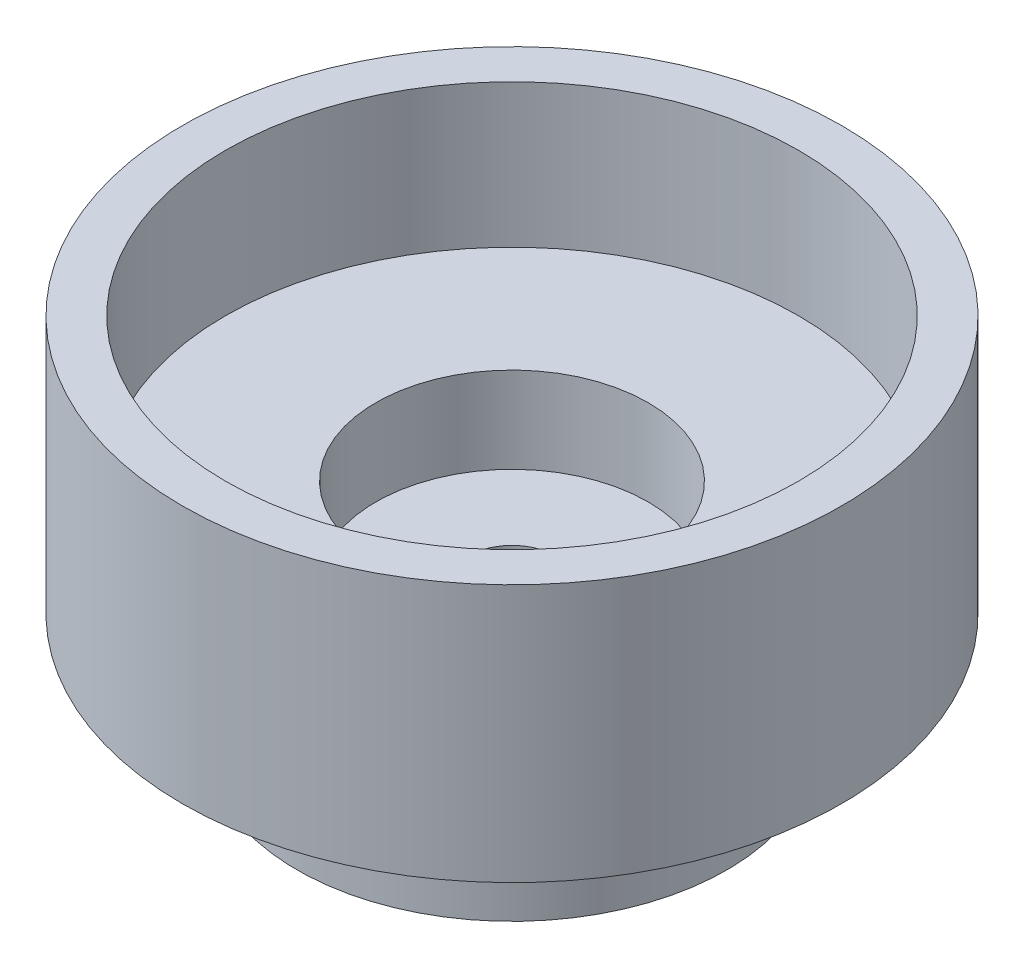
ISO-10303-21;
HEADER;
FILE_DESCRIPTION(('STEP AP214'),'2;1');
FILE_NAME('part.step','',(''),(''),'','','');
FILE_SCHEMA(('AUTOMOTIVE_DESIGN { 1 0 10303 214 1 1 1 1 }'));
ENDSEC;
DATA;
#1=APPLICATION_CONTEXT('core data for automotive mechanical design processes');
#2=APPLICATION_PROTOCOL_DEFINITION('international standard','automotive_design',2000,#1);
#3=PRODUCT_CONTEXT('',#1,'mechanical');
#4=PRODUCT('Part','Part','',(#3));
#5=PRODUCT_RELATED_PRODUCT_CATEGORY('part','',(#4));
#6=PRODUCT_DEFINITION_FORMATION('','',#4);
#7=PRODUCT_DEFINITION_CONTEXT('part definition',#1,'design');
#8=PRODUCT_DEFINITION('design','',#6,#7);
#9=PRODUCT_DEFINITION_SHAPE('','',#8);
#10=(LENGTH_UNIT() NAMED_UNIT(*) SI_UNIT(.MILLI.,.METRE.));
#11=(NAMED_UNIT(*) PLANE_ANGLE_UNIT() SI_UNIT($,.RADIAN.));
#12=(NAMED_UNIT(*) SI_UNIT($,.STERADIAN.) SOLID_ANGLE_UNIT());
#13=UNCERTAINTY_MEASURE_WITH_UNIT(LENGTH_MEASURE(1.E-05),#10,'distance_accuracy_value','');
#14=(GEOMETRIC_REPRESENTATION_CONTEXT(3) GLOBAL_UNCERTAINTY_ASSIGNED_CONTEXT((#13)) GLOBAL_UNIT_ASSIGNED_CONTEXT((#10,
#11,#12)) REPRESENTATION_CONTEXT('',''));
#15=CARTESIAN_POINT('',(0.,0.,0.));
#16=DIRECTION('',(0.,0.,1.));
#17=DIRECTION('',(1.,0.,0.));
#18=AXIS2_PLACEMENT_3D('',#15,#16,#17);
#19=CARTESIAN_POINT('',(0.,1.5,0.));
#20=DIRECTION('',(0.,1.,0.));
#21=DIRECTION('',(0.,0.,1.));
#22=AXIS2_PLACEMENT_3D('',#19,#20,#21);
#23=CYLINDRICAL_SURFACE('',#22,3.);
#24=CARTESIAN_POINT('',(0.,6.,0.));
#25=DIRECTION('',(0.,-1.,0.));
#26=DIRECTION('',(0.,0.,-1.));
#27=AXIS2_PLACEMENT_3D('',#24,#25,#26);
#28=CIRCLE('',#27,3.);
#29=CARTESIAN_POINT('',(0.,6.,-3.));
#30=VERTEX_POINT('',#29);
#31=EDGE_CURVE('E47',#30,#30,#28,.T.);
#32=ORIENTED_EDGE('',*,*,#31,.T.);
#33=EDGE_LOOP('',(#32));
#34=FACE_BOUND('',#33,.T.);
#35=CARTESIAN_POINT('',(0.,10.,0.));
#36=DIRECTION('',(0.,1.,0.));
#37=DIRECTION('',(0.,0.,1.));
#38=AXIS2_PLACEMENT_3D('',#35,#36,#37);
#39=CIRCLE('',#38,3.);
#40=CARTESIAN_POINT('',(0.,10.,3.));
#41=VERTEX_POINT('',#40);
#42=EDGE_CURVE('E35',#41,#41,#39,.F.);
#43=ORIENTED_EDGE('',*,*,#42,.F.);
#44=EDGE_LOOP('',(#43));
#45=FACE_BOUND('',#44,.T.);
#46=ADVANCED_FACE('F31',(#34,#45),#23,.F.);
#47=CARTESIAN_POINT('',(0.,26.,0.));
#48=DIRECTION('',(0.,-1.,0.));
#49=DIRECTION('',(0.,0.,-1.));
#50=AXIS2_PLACEMENT_3D('',#47,#48,#49);
#51=CYLINDRICAL_SURFACE('',#50,23.);
#52=CARTESIAN_POINT('',(0.,26.,0.));
#53=DIRECTION('',(0.,1.,0.));
#54=DIRECTION('',(0.,0.,1.));
#55=AXIS2_PLACEMENT_3D('',#52,#53,#54);
#56=CIRCLE('',#55,23.);
#57=CARTESIAN_POINT('',(0.,26.,-23.));
#58=VERTEX_POINT('',#57);
#59=EDGE_CURVE('E10',#58,#58,#56,.T.);
#60=CARTESIAN_POINT('',(0.,8.,0.));
#61=DIRECTION('',(0.,-1.,0.));
#62=DIRECTION('',(0.,0.,-1.));
#63=AXIS2_PLACEMENT_3D('',#60,#61,#62);
#64=CIRCLE('',#63,23.);
#65=CARTESIAN_POINT('',(0.,8.,-23.));
#66=VERTEX_POINT('',#65);
#67=EDGE_CURVE('E39',#66,#66,#64,.T.);
#68=CARTESIAN_POINT('',(0.,26.,-23.));
#69=CARTESIAN_POINT('',(0.,25.8125,-23.));
#70=CARTESIAN_POINT('',(0.,25.625,-23.));
#71=CARTESIAN_POINT('',(0.,25.25,-23.));
#72=CARTESIAN_POINT('',(0.,25.0625,-23.));
#73=CARTESIAN_POINT('',(0.,24.6875,-23.));
#74=CARTESIAN_POINT('',(0.,24.5,-23.));
#75=CARTESIAN_POINT('',(0.,24.125,-23.));
#76=CARTESIAN_POINT('',(0.,23.9375,-23.));
#77=CARTESIAN_POINT('',(0.,23.5625,-23.));
#78=CARTESIAN_POINT('',(0.,23.375,-23.));
#79=CARTESIAN_POINT('',(0.,23.,-23.));
#80=CARTESIAN_POINT('',(0.,22.8125,-23.));
#81=CARTESIAN_POINT('',(0.,22.4375,-23.));
#82=CARTESIAN_POINT('',(0.,22.25,-23.));
#83=CARTESIAN_POINT('',(0.,21.875,-23.));
#84=CARTESIAN_POINT('',(0.,21.6875,-23.));
#85=CARTESIAN_POINT('',(0.,21.3125,-23.));
#86=CARTESIAN_POINT('',(0.,21.125,-23.));
#87=CARTESIAN_POINT('',(0.,20.75,-23.));
#88=CARTESIAN_POINT('',(0.,20.5625,-23.));
#89=CARTESIAN_POINT('',(0.,20.1875,-23.));
#90=CARTESIAN_POINT('',(0.,20.,-23.));
#91=CARTESIAN_POINT('',(0.,19.625,-23.));
#92=CARTESIAN_POINT('',(0.,19.4375,-23.));
#93=CARTESIAN_POINT('',(0.,19.0625,-23.));
#94=CARTESIAN_POINT('',(0.,18.875,-23.));
#95=CARTESIAN_POINT('',(0.,18.5,-23.));
#96=CARTESIAN_POINT('',(0.,18.3125,-23.));
#97=CARTESIAN_POINT('',(0.,17.9375,-23.));
#98=CARTESIAN_POINT('',(0.,17.75,-23.));
#99=CARTESIAN_POINT('',(0.,17.375,-23.));
#100=CARTESIAN_POINT('',(0.,17.1875,-23.));
#101=CARTESIAN_POINT('',(0.,16.8125,-23.));
#102=CARTESIAN_POINT('',(0.,16.625,-23.));
#103=CARTESIAN_POINT('',(0.,16.25,-23.));
#104=CARTESIAN_POINT('',(0.,16.0625,-23.));
#105=CARTESIAN_POINT('',(0.,15.6875,-23.));
#106=CARTESIAN_POINT('',(0.,15.5,-23.));
#107=CARTESIAN_POINT('',(0.,15.125,-23.));
#108=CARTESIAN_POINT('',(0.,14.9375,-23.));
#109=CARTESIAN_POINT('',(0.,14.5625,-23.));
#110=CARTESIAN_POINT('',(0.,14.375,-23.));
#111=CARTESIAN_POINT('',(0.,14.,-23.));
#112=CARTESIAN_POINT('',(0.,13.8125,-23.));
#113=CARTESIAN_POINT('',(0.,13.4375,-23.));
#114=CARTESIAN_POINT('',(0.,13.25,-23.));
#115=CARTESIAN_POINT('',(0.,12.875,-23.));
#116=CARTESIAN_POINT('',(0.,12.6875,-23.));
#117=CARTESIAN_POINT('',(0.,12.3125,-23.));
#118=CARTESIAN_POINT('',(0.,12.125,-23.));
#119=CARTESIAN_POINT('',(0.,11.75,-23.));
#120=CARTESIAN_POINT('',(0.,11.5625,-23.));
#121=CARTESIAN_POINT('',(0.,11.1875,-23.));
#122=CARTESIAN_POINT('',(0.,11.,-23.));
#123=CARTESIAN_POINT('',(0.,10.625,-23.));
#124=CARTESIAN_POINT('',(0.,10.4375,-23.));
#125=CARTESIAN_POINT('',(0.,10.0625,-23.));
#126=CARTESIAN_POINT('',(0.,9.875,-23.));
#127=CARTESIAN_POINT('',(0.,9.5,-23.));
#128=CARTESIAN_POINT('',(0.,9.3125,-23.));
#129=CARTESIAN_POINT('',(0.,8.9375,-23.));
#130=CARTESIAN_POINT('',(0.,8.75,-23.));
#131=CARTESIAN_POINT('',(0.,8.375,-23.));
#132=CARTESIAN_POINT('',(0.,8.1875,-23.));
#133=CARTESIAN_POINT('',(0.,8.,-23.));
#134=B_SPLINE_CURVE_WITH_KNOTS('',3,(#68,#69,#70,#71,#72,#73,#74,#75,#76,#77,#78,#79,#80,#81,
#82,#83,#84,#85,#86,#87,#88,#89,#90,#91,#92,#93,#94,#95,#96,#97,#98,#99,#100,#101,#102,#103,
#104,#105,#106,#107,#108,#109,#110,#111,#112,#113,#114,#115,#116,#117,#118,#119,#120,#121,#122,
#123,#124,#125,#126,#127,#128,#129,#130,#131,#132,#133),.UNSPECIFIED.,.F.,.F.,(4,2,2,2,2,2,2,2,
2,2,2,2,2,2,2,2,2,2,2,2,2,2,2,2,2,2,2,2,2,2,2,2,4),(0.,0.5625,1.125,1.6875,2.25,2.8125,3.375,
3.9375,4.5,5.0625,5.625,6.1875,6.75,7.3125,7.875,8.4375,9.,9.5625,10.125,10.6875,11.25,11.8125,
12.375,12.9375,13.5,14.0625,14.625,15.1875,15.75,16.3125,16.875,17.4375,18.),.UNSPECIFIED.);
#135=EDGE_CURVE('BSEAM33',#58,#66,#134,.T.);
#136=ORIENTED_EDGE('',*,*,#59,.F.);
#137=ORIENTED_EDGE('',*,*,#67,.F.);
#138=ORIENTED_EDGE('',*,*,#135,.T.);
#139=ORIENTED_EDGE('',*,*,#135,.F.);
#140=EDGE_LOOP('',(#136,#138,#137,#139));
#141=FACE_BOUND('',#140,.T.);
#142=ADVANCED_FACE('F33',(#141),#51,.T.);
#143=CARTESIAN_POINT('',(0.,26.,0.));
#144=DIRECTION('',(0.,1.,0.));
#145=DIRECTION('',(0.,0.,1.));
#146=AXIS2_PLACEMENT_3D('',#143,#144,#145);
#147=PLANE('',#146);
#148=CARTESIAN_POINT('',(0.,26.,0.));
#149=DIRECTION('',(0.,1.,0.));
#150=DIRECTION('',(0.,0.,1.));
#151=AXIS2_PLACEMENT_3D('',#148,#149,#150);
#152=CIRCLE('',#151,20.);
#153=CARTESIAN_POINT('',(0.,26.,20.));
#154=VERTEX_POINT('',#153);
#155=EDGE_CURVE('E57',#154,#154,#152,.T.);
#156=ORIENTED_EDGE('',*,*,#155,.F.);
#157=EDGE_LOOP('',(#156));
#158=FACE_BOUND('',#157,.T.);
#159=ORIENTED_EDGE('',*,*,#59,.T.);
#160=EDGE_LOOP('',(#159));
#161=FACE_BOUND('',#160,.T.);
#162=ADVANCED_FACE('F87',(#158,#161),#147,.T.);
#163=CARTESIAN_POINT('',(0.,8.,0.));
#164=DIRECTION('',(0.,-1.,0.));
#165=DIRECTION('',(0.,0.,-1.));
#166=AXIS2_PLACEMENT_3D('',#163,#164,#165);
#167=PLANE('',#166);
#168=CARTESIAN_POINT('',(0.,8.,0.));
#169=DIRECTION('',(0.,-1.,0.));
#170=DIRECTION('',(0.,0.,-1.));
#171=AXIS2_PLACEMENT_3D('',#168,#169,#170);
#172=CIRCLE('',#171,15.);
#173=CARTESIAN_POINT('',(0.,8.,-15.));
#174=VERTEX_POINT('',#173);
#175=EDGE_CURVE('E44',#174,#174,#172,.T.);
#176=ORIENTED_EDGE('',*,*,#175,.F.);
#177=EDGE_LOOP('',(#176));
#178=FACE_BOUND('',#177,.T.);
#179=ORIENTED_EDGE('',*,*,#67,.T.);
#180=EDGE_LOOP('',(#179));
#181=FACE_BOUND('',#180,.T.);
#182=ADVANCED_FACE('F78',(#178,#181),#167,.T.);
#183=CARTESIAN_POINT('',(0.,8.,0.));
#184=DIRECTION('',(0.,-1.,0.));
#185=DIRECTION('',(0.,0.,-1.));
#186=AXIS2_PLACEMENT_3D('',#183,#184,#185);
#187=CYLINDRICAL_SURFACE('',#186,15.);
#188=ORIENTED_EDGE('',*,*,#175,.T.);
#189=EDGE_LOOP('',(#188));
#190=FACE_BOUND('',#189,.T.);
#191=CARTESIAN_POINT('',(0.,0.,0.));
#192=DIRECTION('',(0.,-1.,0.));
#193=DIRECTION('',(0.,0.,-1.));
#194=AXIS2_PLACEMENT_3D('',#191,#192,#193);
#195=CIRCLE('',#194,15.);
#196=CARTESIAN_POINT('',(0.,0.,-15.));
#197=VERTEX_POINT('',#196);
#198=EDGE_CURVE('E68',#197,#197,#195,.T.);
#199=ORIENTED_EDGE('',*,*,#198,.F.);
#200=EDGE_LOOP('',(#199));
#201=FACE_BOUND('',#200,.T.);
#202=ADVANCED_FACE('F76',(#190,#201),#187,.T.);
#203=CARTESIAN_POINT('',(0.,0.,0.));
#204=DIRECTION('',(0.,1.,0.));
#205=DIRECTION('',(0.,0.,1.));
#206=AXIS2_PLACEMENT_3D('',#203,#204,#205);
#207=PLANE('',#206);
#208=CARTESIAN_POINT('',(0.,0.,0.));
#209=DIRECTION('',(0.,-1.,0.));
#210=DIRECTION('',(0.,0.,-1.));
#211=AXIS2_PLACEMENT_3D('',#208,#209,#210);
#212=CIRCLE('',#211,9.5);
#213=CARTESIAN_POINT('',(0.,0.,-9.5));
#214=VERTEX_POINT('',#213);
#215=EDGE_CURVE('E49',#214,#214,#212,.T.);
#216=ORIENTED_EDGE('',*,*,#215,.F.);
#217=EDGE_LOOP('',(#216));
#218=FACE_BOUND('',#217,.T.);
#219=ORIENTED_EDGE('',*,*,#198,.T.);
#220=EDGE_LOOP('',(#219));
#221=FACE_BOUND('',#220,.T.);
#222=ADVANCED_FACE('F74',(#218,#221),#207,.F.);
#223=CARTESIAN_POINT('',(0.,6.,0.));
#224=DIRECTION('',(0.,-1.,0.));
#225=DIRECTION('',(0.,0.,-1.));
#226=AXIS2_PLACEMENT_3D('',#223,#224,#225);
#227=CYLINDRICAL_SURFACE('',#226,9.5);
#228=CARTESIAN_POINT('',(0.,6.,0.));
#229=DIRECTION('',(0.,-1.,0.));
#230=DIRECTION('',(0.,0.,-1.));
#231=AXIS2_PLACEMENT_3D('',#228,#229,#230);
#232=CIRCLE('',#231,9.5);
#233=CARTESIAN_POINT('',(0.,6.,-9.5));
#234=VERTEX_POINT('',#233);
#235=EDGE_CURVE('E54',#234,#234,#232,.T.);
#236=ORIENTED_EDGE('',*,*,#235,.F.);
#237=EDGE_LOOP('',(#236));
#238=FACE_BOUND('',#237,.T.);
#239=ORIENTED_EDGE('',*,*,#215,.T.);
#240=EDGE_LOOP('',(#239));
#241=FACE_BOUND('',#240,.T.);
#242=ADVANCED_FACE('F85',(#238,#241),#227,.F.);
#243=CARTESIAN_POINT('',(0.,6.,0.));
#244=DIRECTION('',(0.,-1.,0.));
#245=DIRECTION('',(0.,0.,-1.));
#246=AXIS2_PLACEMENT_3D('',#243,#244,#245);
#247=PLANE('',#246);
#248=ORIENTED_EDGE('',*,*,#31,.F.);
#249=EDGE_LOOP('',(#248));
#250=FACE_BOUND('',#249,.T.);
#251=ORIENTED_EDGE('',*,*,#235,.T.);
#252=EDGE_LOOP('',(#251));
#253=FACE_BOUND('',#252,.T.);
#254=ADVANCED_FACE('F102',(#250,#253),#247,.T.);
#255=CARTESIAN_POINT('',(0.,16.,0.));
#256=DIRECTION('',(0.,1.,0.));
#257=DIRECTION('',(0.,0.,1.));
#258=AXIS2_PLACEMENT_3D('',#255,#256,#257);
#259=PLANE('',#258);
#260=CARTESIAN_POINT('',(0.,16.,0.));
#261=DIRECTION('',(0.,1.,0.));
#262=DIRECTION('',(0.,0.,1.));
#263=AXIS2_PLACEMENT_3D('',#260,#261,#262);
#264=CIRCLE('',#263,9.5);
#265=CARTESIAN_POINT('',(0.,16.,9.5));
#266=VERTEX_POINT('',#265);
#267=EDGE_CURVE('E64',#266,#266,#264,.T.);
#268=ORIENTED_EDGE('',*,*,#267,.F.);
#269=EDGE_LOOP('',(#268));
#270=FACE_BOUND('',#269,.T.);
#271=CARTESIAN_POINT('',(0.,16.,0.));
#272=DIRECTION('',(0.,1.,0.));
#273=DIRECTION('',(0.,0.,1.));
#274=AXIS2_PLACEMENT_3D('',#271,#272,#273);
#275=CIRCLE('',#274,20.);
#276=CARTESIAN_POINT('',(0.,16.,20.));
#277=VERTEX_POINT('',#276);
#278=EDGE_CURVE('E50',#277,#277,#275,.T.);
#279=ORIENTED_EDGE('',*,*,#278,.T.);
#280=EDGE_LOOP('',(#279));
#281=FACE_BOUND('',#280,.T.);
#282=ADVANCED_FACE('F104',(#270,#281),#259,.T.);
#283=CARTESIAN_POINT('',(0.,16.,0.));
#284=DIRECTION('',(0.,1.,0.));
#285=DIRECTION('',(0.,0.,1.));
#286=AXIS2_PLACEMENT_3D('',#283,#284,#285);
#287=CYLINDRICAL_SURFACE('',#286,20.);
#288=ORIENTED_EDGE('',*,*,#278,.F.);
#289=EDGE_LOOP('',(#288));
#290=FACE_BOUND('',#289,.T.);
#291=ORIENTED_EDGE('',*,*,#155,.T.);
#292=EDGE_LOOP('',(#291));
#293=FACE_BOUND('',#292,.T.);
#294=ADVANCED_FACE('F100',(#290,#293),#287,.F.);
#295=CARTESIAN_POINT('',(0.,10.,0.));
#296=DIRECTION('',(0.,1.,0.));
#297=DIRECTION('',(0.,0.,1.));
#298=AXIS2_PLACEMENT_3D('',#295,#296,#297);
#299=PLANE('',#298);
#300=CARTESIAN_POINT('',(0.,10.,0.));
#301=DIRECTION('',(0.,1.,0.));
#302=DIRECTION('',(0.,0.,1.));
#303=AXIS2_PLACEMENT_3D('',#300,#301,#302);
#304=CIRCLE('',#303,9.5);
#305=CARTESIAN_POINT('',(0.,10.,9.5));
#306=VERTEX_POINT('',#305);
#307=EDGE_CURVE('E200',#306,#306,#304,.T.);
#308=ORIENTED_EDGE('',*,*,#307,.T.);
#309=EDGE_LOOP('',(#308));
#310=FACE_BOUND('',#309,.T.);
#311=ORIENTED_EDGE('',*,*,#42,.T.);
#312=EDGE_LOOP('',(#311));
#313=FACE_BOUND('',#312,.T.);
#314=ADVANCED_FACE('F134',(#310,#313),#299,.T.);
#315=CARTESIAN_POINT('',(0.,10.,0.));
#316=DIRECTION('',(0.,1.,0.));
#317=DIRECTION('',(0.,0.,1.));
#318=AXIS2_PLACEMENT_3D('',#315,#316,#317);
#319=CYLINDRICAL_SURFACE('',#318,9.5);
#320=ORIENTED_EDGE('',*,*,#307,.F.);
#321=EDGE_LOOP('',(#320));
#322=FACE_BOUND('',#321,.T.);
#323=ORIENTED_EDGE('',*,*,#267,.T.);
#324=EDGE_LOOP('',(#323));
#325=FACE_BOUND('',#324,.T.);
#326=ADVANCED_FACE('F140',(#322,#325),#319,.F.);
#327=CLOSED_SHELL('',(#46,#142,#162,#182,#202,#222,#242,#254,#282,#294,#314,#326));
#328=MANIFOLD_SOLID_BREP('B2',#327);
#329=ADVANCED_BREP_SHAPE_REPRESENTATION('',(#18,#328),#14);
#330=SHAPE_DEFINITION_REPRESENTATION(#9,#329);
ENDSEC;
END-ISO-10303-21;
